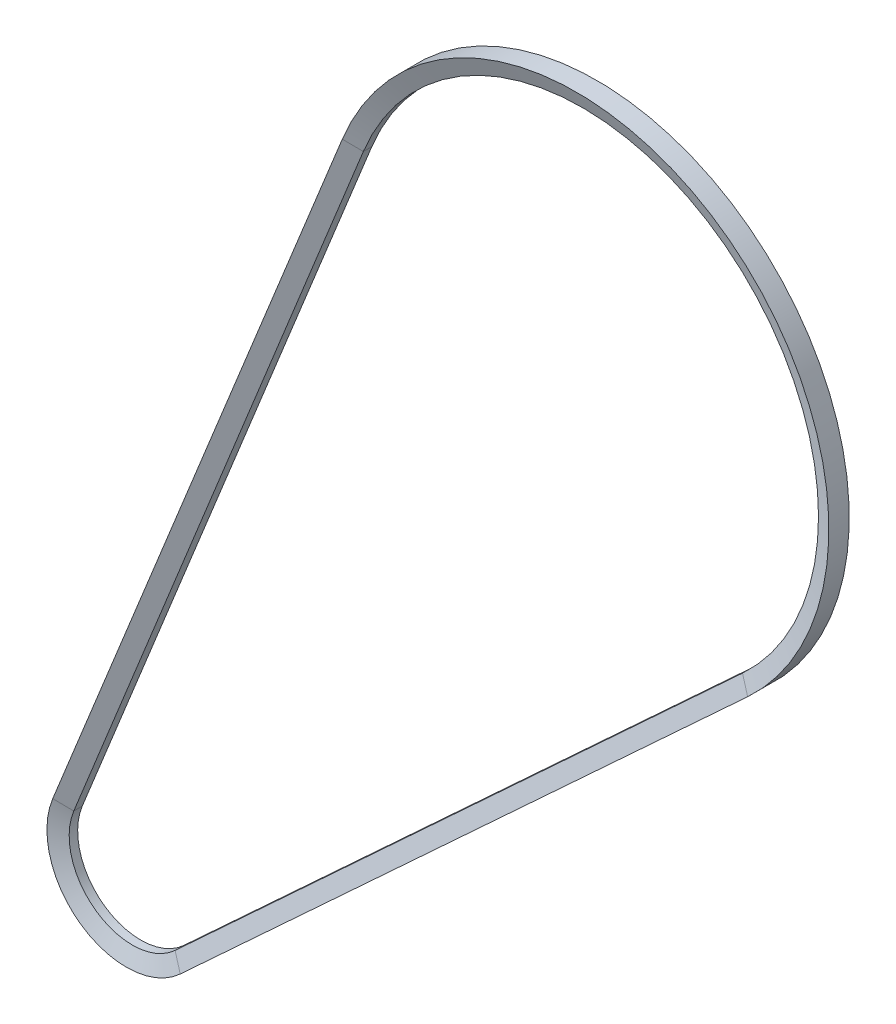
ISO-10303-21;
HEADER;
FILE_DESCRIPTION(('STEP AP214'),'2;1');
FILE_NAME('part.step','',(''),(''),'','','');
FILE_SCHEMA(('AUTOMOTIVE_DESIGN { 1 0 10303 214 1 1 1 1 }'));
ENDSEC;
DATA;
#1=APPLICATION_CONTEXT('core data for automotive mechanical design processes');
#2=APPLICATION_PROTOCOL_DEFINITION('international standard','automotive_design',2000,#1);
#3=PRODUCT_CONTEXT('',#1,'mechanical');
#4=PRODUCT('Part','Part','',(#3));
#5=PRODUCT_RELATED_PRODUCT_CATEGORY('part','',(#4));
#6=PRODUCT_DEFINITION_FORMATION('','',#4);
#7=PRODUCT_DEFINITION_CONTEXT('part definition',#1,'design');
#8=PRODUCT_DEFINITION('design','',#6,#7);
#9=PRODUCT_DEFINITION_SHAPE('','',#8);
#10=(LENGTH_UNIT() NAMED_UNIT(*) SI_UNIT(.MILLI.,.METRE.));
#11=(NAMED_UNIT(*) PLANE_ANGLE_UNIT() SI_UNIT($,.RADIAN.));
#12=(NAMED_UNIT(*) SI_UNIT($,.STERADIAN.) SOLID_ANGLE_UNIT());
#13=UNCERTAINTY_MEASURE_WITH_UNIT(LENGTH_MEASURE(1.E-05),#10,'distance_accuracy_value','');
#14=(GEOMETRIC_REPRESENTATION_CONTEXT(3) GLOBAL_UNCERTAINTY_ASSIGNED_CONTEXT((#13)) GLOBAL_UNIT_ASSIGNED_CONTEXT((#10,
#11,#12)) REPRESENTATION_CONTEXT('',''));
#15=CARTESIAN_POINT('',(0.,0.,0.));
#16=DIRECTION('',(0.,0.,1.));
#17=DIRECTION('',(1.,0.,0.));
#18=AXIS2_PLACEMENT_3D('',#15,#16,#17);
#19=CARTESIAN_POINT('',(106.047082260726,366.195448280781,5.));
#20=DIRECTION('',(-0.317066237029301,0.128244999031494,-0.939692620785909));
#21=DIRECTION('',(-0.947516723931443,0.,0.319706205554763));
#22=AXIS2_PLACEMENT_3D('',#19,#20,#21);
#23=PLANE('',#22);
#24=DIRECTION('',(0.87113232670946,-0.352350238997014,-0.342020143325666));
#25=VECTOR('',#24,1.);
#26=CARTESIAN_POINT('',(106.047082260726,366.195448280781,5.));
#27=LINE('',#26,#25);
#28=CARTESIAN_POINT('',(106.047082260726,366.195448280781,5.));
#29=VERTEX_POINT('',#28);
#30=CARTESIAN_POINT('',(113.463399532482,363.195741941044,2.08823812587041));
#31=VERTEX_POINT('',#30);
#32=EDGE_CURVE('E149',#29,#31,#27,.T.);
#33=ORIENTED_EDGE('',*,*,#32,.F.);
#34=DIRECTION('',(-0.374963292467198,-0.927039658969431,0.));
#35=VECTOR('',#34,1.);
#36=CARTESIAN_POINT('',(106.047082260726,366.195448280781,5.));
#37=LINE('',#36,#35);
#38=CARTESIAN_POINT('',(-36.1545466999687,14.6235684062927,5.));
#39=VERTEX_POINT('',#38);
#40=EDGE_CURVE('E148',#29,#39,#37,.T.);
#41=ORIENTED_EDGE('',*,*,#40,.T.);
#42=DIRECTION('',(0.87113232670946,-0.352350238997014,-0.342020143325666));
#43=VECTOR('',#42,1.);
#44=CARTESIAN_POINT('',(-36.1545466999687,14.6235684062927,5.));
#45=LINE('',#44,#43);
#46=CARTESIAN_POINT('',(-28.7382294282132,11.6238620665551,2.08823812587041));
#47=VERTEX_POINT('',#46);
#48=EDGE_CURVE('E127',#39,#47,#45,.T.);
#49=ORIENTED_EDGE('',*,*,#48,.T.);
#50=DIRECTION('',(-0.374963292467198,-0.927039658969431,0.));
#51=VECTOR('',#50,1.);
#52=CARTESIAN_POINT('',(113.463399532482,363.195741941044,2.08823812587041));
#53=LINE('',#52,#51);
#54=EDGE_CURVE('E153',#31,#47,#53,.T.);
#55=ORIENTED_EDGE('',*,*,#54,.F.);
#56=EDGE_LOOP('',(#33,#41,#49,#55));
#57=FACE_BOUND('',#56,.T.);
#58=ADVANCED_FACE('F33',(#57),#23,.F.);
#59=CARTESIAN_POINT('',(-1.60871316268185E-10,7.19979631469414E-11,5.));
#60=DIRECTION('',(0.,0.,1.));
#61=DIRECTION('',(1.,0.,0.));
#62=AXIS2_PLACEMENT_3D('',#59,#60,#61);
#63=CONICAL_SURFACE('',#62,39.,1.22173047639603);
#64=CARTESIAN_POINT('',(-1.60871316268185E-10,7.19979631469414E-11,2.08823812587041));
#65=DIRECTION('',(0.,0.,1.));
#66=DIRECTION('',(-0.927039658969431,0.374963292467198,0.));
#67=AXIS2_PLACEMENT_3D('',#64,#65,#66);
#68=CIRCLE('',#67,31.);
#69=CARTESIAN_POINT('',(21.027689762475,-22.7779775933479,2.08823812587041));
#70=VERTEX_POINT('',#69);
#71=EDGE_CURVE('E117',#47,#70,#68,.T.);
#72=ORIENTED_EDGE('',*,*,#71,.F.);
#73=ORIENTED_EDGE('',*,*,#48,.F.);
#74=CARTESIAN_POINT('',(-1.60871316268185E-10,7.19979631469414E-11,5.));
#75=DIRECTION('',(0.,0.,1.));
#76=DIRECTION('',(-0.927039658969431,0.374963292467198,0.));
#77=AXIS2_PLACEMENT_3D('',#74,#75,#76);
#78=CIRCLE('',#77,39.);
#79=CARTESIAN_POINT('',(26.454190346369,-28.6561653594028,5.));
#80=VERTEX_POINT('',#79);
#81=EDGE_CURVE('E130',#39,#80,#78,.T.);
#82=ORIENTED_EDGE('',*,*,#81,.T.);
#83=DIRECTION('',(-0.637405319421962,0.690461208419471,-0.342020143325666));
#84=VECTOR('',#83,1.);
#85=CARTESIAN_POINT('',(26.4541903465984,-28.6561653596513,5.));
#86=LINE('',#85,#84);
#87=EDGE_CURVE('E145',#80,#70,#86,.T.);
#88=ORIENTED_EDGE('',*,*,#87,.T.);
#89=EDGE_LOOP('',(#72,#73,#82,#88));
#90=FACE_BOUND('',#89,.T.);
#91=ADVANCED_FACE('F129',(#90),#63,.F.);
#92=CARTESIAN_POINT('',(-1.60871316268185E-10,7.19979631469414E-11,0.));
#93=DIRECTION('',(0.,0.,1.));
#94=DIRECTION('',(1.,0.,0.));
#95=AXIS2_PLACEMENT_3D('',#92,#93,#94);
#96=CYLINDRICAL_SURFACE('',#95,31.);
#97=CARTESIAN_POINT('',(-1.60871316268185E-10,7.19979631469414E-11,-2.08823812587041));
#98=DIRECTION('',(0.,0.,1.));
#99=DIRECTION('',(-0.927039658969431,0.374963292467198,0.));
#100=AXIS2_PLACEMENT_3D('',#97,#98,#99);
#101=CIRCLE('',#100,31.);
#102=CARTESIAN_POINT('',(-28.7382294282132,11.6238620665551,-2.08823812587041));
#103=VERTEX_POINT('',#102);
#104=CARTESIAN_POINT('',(21.027689762475,-22.7779775933479,-2.08823812587041));
#105=VERTEX_POINT('',#104);
#106=EDGE_CURVE('E111',#103,#105,#101,.T.);
#107=ORIENTED_EDGE('',*,*,#106,.F.);
#108=DIRECTION('',(0.,0.,-1.));
#109=VECTOR('',#108,1.);
#110=CARTESIAN_POINT('',(-28.7382294282132,11.6238620665551,2.08823812587041));
#111=LINE('',#110,#109);
#112=EDGE_CURVE('E135',#47,#103,#111,.T.);
#113=ORIENTED_EDGE('',*,*,#112,.F.);
#114=ORIENTED_EDGE('',*,*,#71,.T.);
#115=DIRECTION('',(0.,0.,-1.));
#116=VECTOR('',#115,1.);
#117=CARTESIAN_POINT('',(21.0276897627043,-22.7779775935964,2.08823812587041));
#118=LINE('',#117,#116);
#119=EDGE_CURVE('E200',#70,#105,#118,.T.);
#120=ORIENTED_EDGE('',*,*,#119,.T.);
#121=EDGE_LOOP('',(#107,#113,#114,#120));
#122=FACE_BOUND('',#121,.T.);
#123=ADVANCED_FACE('F216',(#122),#96,.F.);
#124=CARTESIAN_POINT('',(-1.60871316268185E-10,7.19979631469414E-11,-2.08823812587041));
#125=DIRECTION('',(0.,0.,-1.));
#126=DIRECTION('',(-1.,0.,0.));
#127=AXIS2_PLACEMENT_3D('',#124,#125,#126);
#128=CONICAL_SURFACE('',#127,31.,1.22173047639603);
#129=CARTESIAN_POINT('',(-1.60871316268185E-10,7.19979631469414E-11,-5.));
#130=DIRECTION('',(0.,0.,1.));
#131=DIRECTION('',(-0.927039658969431,0.374963292467198,0.));
#132=AXIS2_PLACEMENT_3D('',#129,#130,#131);
#133=CIRCLE('',#132,39.);
#134=CARTESIAN_POINT('',(-36.1545466999687,14.6235684062927,-5.));
#135=VERTEX_POINT('',#134);
#136=CARTESIAN_POINT('',(26.454190346369,-28.6561653594028,-5.));
#137=VERTEX_POINT('',#136);
#138=EDGE_CURVE('E163',#135,#137,#133,.T.);
#139=ORIENTED_EDGE('',*,*,#138,.F.);
#140=DIRECTION('',(-0.87113232670946,0.352350238997014,-0.342020143325666));
#141=VECTOR('',#140,1.);
#142=CARTESIAN_POINT('',(-28.7382294282132,11.6238620665551,-2.08823812587041));
#143=LINE('',#142,#141);
#144=EDGE_CURVE('E156',#103,#135,#143,.T.);
#145=ORIENTED_EDGE('',*,*,#144,.F.);
#146=ORIENTED_EDGE('',*,*,#106,.T.);
#147=DIRECTION('',(0.637405319421962,-0.690461208419471,-0.342020143325666));
#148=VECTOR('',#147,1.);
#149=CARTESIAN_POINT('',(21.0276897627043,-22.7779775935964,-2.08823812587041));
#150=LINE('',#149,#148);
#151=EDGE_CURVE('E185',#105,#137,#150,.T.);
#152=ORIENTED_EDGE('',*,*,#151,.T.);
#153=EDGE_LOOP('',(#139,#145,#146,#152));
#154=FACE_BOUND('',#153,.T.);
#155=ADVANCED_FACE('F186',(#154),#128,.F.);
#156=CARTESIAN_POINT('',(-1.60871316268185E-10,7.19979631469414E-11,0.));
#157=DIRECTION('',(0.,0.,1.));
#158=DIRECTION('',(1.,0.,0.));
#159=AXIS2_PLACEMENT_3D('',#156,#157,#158);
#160=CYLINDRICAL_SURFACE('',#159,39.);
#161=DIRECTION('',(0.,0.,1.));
#162=VECTOR('',#161,1.);
#163=CARTESIAN_POINT('',(26.4541903465984,-28.6561653596513,-5.));
#164=LINE('',#163,#162);
#165=EDGE_CURVE('E143',#137,#80,#164,.T.);
#166=ORIENTED_EDGE('',*,*,#165,.T.);
#167=ORIENTED_EDGE('',*,*,#81,.F.);
#168=DIRECTION('',(0.,0.,1.));
#169=VECTOR('',#168,1.);
#170=CARTESIAN_POINT('',(-36.1545466999687,14.6235684062927,-5.));
#171=LINE('',#170,#169);
#172=EDGE_CURVE('E142',#135,#39,#171,.T.);
#173=ORIENTED_EDGE('',*,*,#172,.F.);
#174=ORIENTED_EDGE('',*,*,#138,.T.);
#175=EDGE_LOOP('',(#166,#167,#173,#174));
#176=FACE_BOUND('',#175,.T.);
#177=ADVANCED_FACE('F140',(#176),#160,.T.);
#178=CARTESIAN_POINT('',(26.4541903465984,-28.6561653596513,5.));
#179=DIRECTION('',(0.231996563432533,-0.251307327780158,-0.939692620785909));
#180=DIRECTION('',(0.,0.966049736893978,-0.258356160845985));
#181=AXIS2_PLACEMENT_3D('',#178,#179,#180);
#182=PLANE('',#181);
#183=DIRECTION('',(0.734773470756859,0.678312572986761,0.));
#184=VECTOR('',#183,1.);
#185=CARTESIAN_POINT('',(21.0276897627044,-22.7779775935964,2.08823812587041));
#186=LINE('',#185,#184);
#187=CARTESIAN_POINT('',(299.68425843963,234.466277406805,2.08823812587041));
#188=VERTEX_POINT('',#187);
#189=EDGE_CURVE('E98',#70,#188,#186,.T.);
#190=ORIENTED_EDGE('',*,*,#189,.F.);
#191=ORIENTED_EDGE('',*,*,#87,.F.);
#192=DIRECTION('',(0.734773470756859,0.678312572986761,0.));
#193=VECTOR('',#192,1.);
#194=CARTESIAN_POINT('',(26.4541903465984,-28.6561653596513,5.));
#195=LINE('',#194,#193);
#196=CARTESIAN_POINT('',(305.110759023524,228.58808964075,5.));
#197=VERTEX_POINT('',#196);
#198=EDGE_CURVE('E162',#80,#197,#195,.T.);
#199=ORIENTED_EDGE('',*,*,#198,.T.);
#200=DIRECTION('',(-0.637405319421963,0.690461208419471,-0.342020143325666));
#201=VECTOR('',#200,1.);
#202=CARTESIAN_POINT('',(305.110759023294,228.588089640998,5.));
#203=LINE('',#202,#201);
#204=EDGE_CURVE('E191',#197,#188,#203,.T.);
#205=ORIENTED_EDGE('',*,*,#204,.T.);
#206=EDGE_LOOP('',(#190,#191,#199,#205));
#207=FACE_BOUND('',#206,.T.);
#208=ADVANCED_FACE('F215',(#207),#182,.F.);
#209=CARTESIAN_POINT('',(21.0276897627044,-22.7779775935964,2.08823812587041));
#210=DIRECTION('',(0.678312572986761,-0.734773470756859,0.));
#211=DIRECTION('',(0.734773470756859,0.678312572986761,0.));
#212=AXIS2_PLACEMENT_3D('',#209,#210,#211);
#213=PLANE('',#212);
#214=DIRECTION('',(0.734773470756859,0.678312572986761,0.));
#215=VECTOR('',#214,1.);
#216=CARTESIAN_POINT('',(21.0276897627044,-22.7779775935964,-2.08823812587041));
#217=LINE('',#216,#215);
#218=CARTESIAN_POINT('',(299.68425843963,234.466277406805,-2.08823812587041));
#219=VERTEX_POINT('',#218);
#220=EDGE_CURVE('E91',#105,#219,#217,.T.);
#221=ORIENTED_EDGE('',*,*,#220,.F.);
#222=ORIENTED_EDGE('',*,*,#119,.F.);
#223=ORIENTED_EDGE('',*,*,#189,.T.);
#224=DIRECTION('',(0.,0.,-1.));
#225=VECTOR('',#224,1.);
#226=CARTESIAN_POINT('',(299.6842584394,234.466277407053,2.08823812587041));
#227=LINE('',#226,#225);
#228=EDGE_CURVE('E203',#188,#219,#227,.T.);
#229=ORIENTED_EDGE('',*,*,#228,.T.);
#230=EDGE_LOOP('',(#221,#222,#223,#229));
#231=FACE_BOUND('',#230,.T.);
#232=ADVANCED_FACE('F205',(#231),#213,.F.);
#233=CARTESIAN_POINT('',(21.0276897627044,-22.7779775935964,-2.08823812587041));
#234=DIRECTION('',(0.231996563432533,-0.251307327780158,0.93969262078591));
#235=DIRECTION('',(0.,-0.966049736893978,-0.258356160845985));
#236=AXIS2_PLACEMENT_3D('',#233,#234,#235);
#237=PLANE('',#236);
#238=DIRECTION('',(0.734773470756859,0.678312572986761,0.));
#239=VECTOR('',#238,1.);
#240=CARTESIAN_POINT('',(26.4541903465984,-28.6561653596513,-5.));
#241=LINE('',#240,#239);
#242=CARTESIAN_POINT('',(305.110759023524,228.58808964075,-5.));
#243=VERTEX_POINT('',#242);
#244=EDGE_CURVE('E82',#137,#243,#241,.T.);
#245=ORIENTED_EDGE('',*,*,#244,.F.);
#246=ORIENTED_EDGE('',*,*,#151,.F.);
#247=ORIENTED_EDGE('',*,*,#220,.T.);
#248=DIRECTION('',(0.637405319421963,-0.690461208419471,-0.342020143325666));
#249=VECTOR('',#248,1.);
#250=CARTESIAN_POINT('',(299.6842584394,234.466277407053,-2.08823812587041));
#251=LINE('',#250,#249);
#252=EDGE_CURVE('E169',#219,#243,#251,.T.);
#253=ORIENTED_EDGE('',*,*,#252,.T.);
#254=EDGE_LOOP('',(#245,#246,#247,#253));
#255=FACE_BOUND('',#254,.T.);
#256=ADVANCED_FACE('F187',(#255),#237,.F.);
#257=CARTESIAN_POINT('',(26.4541903465984,-28.6561653596513,-5.));
#258=DIRECTION('',(-0.678312572986761,0.734773470756859,0.));
#259=DIRECTION('',(-0.734773470756859,-0.678312572986761,0.));
#260=AXIS2_PLACEMENT_3D('',#257,#258,#259);
#261=PLANE('',#260);
#262=DIRECTION('',(0.,0.,1.));
#263=VECTOR('',#262,1.);
#264=CARTESIAN_POINT('',(305.110759023294,228.588089640998,-5.));
#265=LINE('',#264,#263);
#266=EDGE_CURVE('E164',#243,#197,#265,.T.);
#267=ORIENTED_EDGE('',*,*,#266,.T.);
#268=ORIENTED_EDGE('',*,*,#198,.F.);
#269=ORIENTED_EDGE('',*,*,#165,.F.);
#270=ORIENTED_EDGE('',*,*,#244,.T.);
#271=EDGE_LOOP('',(#267,#268,#269,#270));
#272=FACE_BOUND('',#271,.T.);
#273=ADVANCED_FACE('F188',(#272),#261,.F.);
#274=CARTESIAN_POINT('',(220.999999972936,319.700000014849,5.));
#275=DIRECTION('',(0.,0.,1.));
#276=DIRECTION('',(1.,0.,0.));
#277=AXIS2_PLACEMENT_3D('',#274,#275,#276);
#278=CONICAL_SURFACE('',#277,124.,1.22173047639603);
#279=CARTESIAN_POINT('',(220.999999972936,319.700000014849,2.08823812587041));
#280=DIRECTION('',(0.,0.,1.));
#281=DIRECTION('',(0.678312572986761,-0.734773470756859,0.));
#282=AXIS2_PLACEMENT_3D('',#279,#280,#281);
#283=CIRCLE('',#282,116.);
#284=EDGE_CURVE('E167',#188,#31,#283,.T.);
#285=ORIENTED_EDGE('',*,*,#284,.F.);
#286=ORIENTED_EDGE('',*,*,#204,.F.);
#287=CARTESIAN_POINT('',(220.999999972936,319.700000014849,5.));
#288=DIRECTION('',(0.,0.,1.));
#289=DIRECTION('',(0.678312572986761,-0.734773470756859,0.));
#290=AXIS2_PLACEMENT_3D('',#287,#288,#289);
#291=CIRCLE('',#290,124.);
#292=EDGE_CURVE('E165',#197,#29,#291,.T.);
#293=ORIENTED_EDGE('',*,*,#292,.T.);
#294=ORIENTED_EDGE('',*,*,#32,.T.);
#295=EDGE_LOOP('',(#285,#286,#293,#294));
#296=FACE_BOUND('',#295,.T.);
#297=ADVANCED_FACE('F214',(#296),#278,.F.);
#298=CARTESIAN_POINT('',(220.999999972936,319.700000014849,0.));
#299=DIRECTION('',(0.,0.,1.));
#300=DIRECTION('',(1.,0.,0.));
#301=AXIS2_PLACEMENT_3D('',#298,#299,#300);
#302=CYLINDRICAL_SURFACE('',#301,116.);
#303=CARTESIAN_POINT('',(220.999999972936,319.700000014849,-2.08823812587041));
#304=DIRECTION('',(0.,0.,1.));
#305=DIRECTION('',(0.678312572986761,-0.734773470756859,0.));
#306=AXIS2_PLACEMENT_3D('',#303,#304,#305);
#307=CIRCLE('',#306,116.);
#308=CARTESIAN_POINT('',(113.463399532482,363.195741941044,-2.08823812587041));
#309=VERTEX_POINT('',#308);
#310=EDGE_CURVE('E58',#219,#309,#307,.T.);
#311=ORIENTED_EDGE('',*,*,#310,.F.);
#312=ORIENTED_EDGE('',*,*,#228,.F.);
#313=ORIENTED_EDGE('',*,*,#284,.T.);
#314=DIRECTION('',(0.,0.,-1.));
#315=VECTOR('',#314,1.);
#316=CARTESIAN_POINT('',(113.463399532482,363.195741941044,2.08823812587041));
#317=LINE('',#316,#315);
#318=EDGE_CURVE('E175',#31,#309,#317,.T.);
#319=ORIENTED_EDGE('',*,*,#318,.T.);
#320=EDGE_LOOP('',(#311,#312,#313,#319));
#321=FACE_BOUND('',#320,.T.);
#322=ADVANCED_FACE('F207',(#321),#302,.F.);
#323=CARTESIAN_POINT('',(220.999999972936,319.700000014849,-2.08823812587041));
#324=DIRECTION('',(0.,0.,-1.));
#325=DIRECTION('',(-1.,0.,0.));
#326=AXIS2_PLACEMENT_3D('',#323,#324,#325);
#327=CONICAL_SURFACE('',#326,116.,1.22173047639603);
#328=CARTESIAN_POINT('',(220.999999972936,319.700000014849,-5.));
#329=DIRECTION('',(0.,0.,1.));
#330=DIRECTION('',(0.678312572986761,-0.734773470756859,0.));
#331=AXIS2_PLACEMENT_3D('',#328,#329,#330);
#332=CIRCLE('',#331,124.);
#333=CARTESIAN_POINT('',(106.047082260726,366.195448280781,-5.));
#334=VERTEX_POINT('',#333);
#335=EDGE_CURVE('E50',#243,#334,#332,.T.);
#336=ORIENTED_EDGE('',*,*,#335,.F.);
#337=ORIENTED_EDGE('',*,*,#252,.F.);
#338=ORIENTED_EDGE('',*,*,#310,.T.);
#339=DIRECTION('',(-0.87113232670946,0.352350238997014,-0.342020143325666));
#340=VECTOR('',#339,1.);
#341=CARTESIAN_POINT('',(113.463399532482,363.195741941044,-2.08823812587041));
#342=LINE('',#341,#340);
#343=EDGE_CURVE('E174',#309,#334,#342,.T.);
#344=ORIENTED_EDGE('',*,*,#343,.T.);
#345=EDGE_LOOP('',(#336,#337,#338,#344));
#346=FACE_BOUND('',#345,.T.);
#347=ADVANCED_FACE('F210',(#346),#327,.F.);
#348=CARTESIAN_POINT('',(220.999999972936,319.700000014849,0.));
#349=DIRECTION('',(0.,0.,1.));
#350=DIRECTION('',(1.,0.,0.));
#351=AXIS2_PLACEMENT_3D('',#348,#349,#350);
#352=CYLINDRICAL_SURFACE('',#351,124.);
#353=DIRECTION('',(0.,0.,1.));
#354=VECTOR('',#353,1.);
#355=CARTESIAN_POINT('',(106.047082260726,366.195448280781,-5.));
#356=LINE('',#355,#354);
#357=EDGE_CURVE('E37',#334,#29,#356,.T.);
#358=ORIENTED_EDGE('',*,*,#357,.T.);
#359=ORIENTED_EDGE('',*,*,#292,.F.);
#360=ORIENTED_EDGE('',*,*,#266,.F.);
#361=ORIENTED_EDGE('',*,*,#335,.T.);
#362=EDGE_LOOP('',(#358,#359,#360,#361));
#363=FACE_BOUND('',#362,.T.);
#364=ADVANCED_FACE('F211',(#363),#352,.T.);
#365=CARTESIAN_POINT('',(113.463399532482,363.195741941044,2.08823812587041));
#366=DIRECTION('',(-0.927039658969431,0.374963292467198,0.));
#367=DIRECTION('',(-0.374963292467198,-0.927039658969431,0.));
#368=AXIS2_PLACEMENT_3D('',#365,#366,#367);
#369=PLANE('',#368);
#370=ORIENTED_EDGE('',*,*,#54,.T.);
#371=ORIENTED_EDGE('',*,*,#112,.T.);
#372=DIRECTION('',(-0.374963292467198,-0.927039658969431,0.));
#373=VECTOR('',#372,1.);
#374=CARTESIAN_POINT('',(113.463399532482,363.195741941044,-2.08823812587041));
#375=LINE('',#374,#373);
#376=EDGE_CURVE('E42',#309,#103,#375,.T.);
#377=ORIENTED_EDGE('',*,*,#376,.F.);
#378=ORIENTED_EDGE('',*,*,#318,.F.);
#379=EDGE_LOOP('',(#370,#371,#377,#378));
#380=FACE_BOUND('',#379,.T.);
#381=ADVANCED_FACE('F219',(#380),#369,.F.);
#382=CARTESIAN_POINT('',(113.463399532482,363.195741941044,-2.08823812587041));
#383=DIRECTION('',(-0.317066237029301,0.128244999031494,0.939692620785909));
#384=DIRECTION('',(0.947516723931444,0.,0.319706205554763));
#385=AXIS2_PLACEMENT_3D('',#382,#383,#384);
#386=PLANE('',#385);
#387=ORIENTED_EDGE('',*,*,#376,.T.);
#388=ORIENTED_EDGE('',*,*,#144,.T.);
#389=DIRECTION('',(-0.374963292467198,-0.927039658969431,0.));
#390=VECTOR('',#389,1.);
#391=CARTESIAN_POINT('',(106.047082260726,366.195448280781,-5.));
#392=LINE('',#391,#390);
#393=EDGE_CURVE('E11',#334,#135,#392,.T.);
#394=ORIENTED_EDGE('',*,*,#393,.F.);
#395=ORIENTED_EDGE('',*,*,#343,.F.);
#396=EDGE_LOOP('',(#387,#388,#394,#395));
#397=FACE_BOUND('',#396,.T.);
#398=ADVANCED_FACE('F221',(#397),#386,.F.);
#399=CARTESIAN_POINT('',(106.047082260726,366.195448280781,-5.));
#400=DIRECTION('',(0.927039658969431,-0.374963292467198,0.));
#401=DIRECTION('',(0.374963292467198,0.927039658969431,0.));
#402=AXIS2_PLACEMENT_3D('',#399,#400,#401);
#403=PLANE('',#402);
#404=ORIENTED_EDGE('',*,*,#393,.T.);
#405=ORIENTED_EDGE('',*,*,#172,.T.);
#406=ORIENTED_EDGE('',*,*,#40,.F.);
#407=ORIENTED_EDGE('',*,*,#357,.F.);
#408=EDGE_LOOP('',(#404,#405,#406,#407));
#409=FACE_BOUND('',#408,.T.);
#410=ADVANCED_FACE('F35',(#409),#403,.F.);
#411=CLOSED_SHELL('',(#58,#91,#123,#155,#177,#208,#232,#256,#273,#297,#322,#347,#364,#381,#398,#410));
#412=MANIFOLD_SOLID_BREP('B2',#411);
#413=ADVANCED_BREP_SHAPE_REPRESENTATION('',(#18,#412),#14);
#414=SHAPE_DEFINITION_REPRESENTATION(#9,#413);
ENDSEC;
END-ISO-10303-21;
